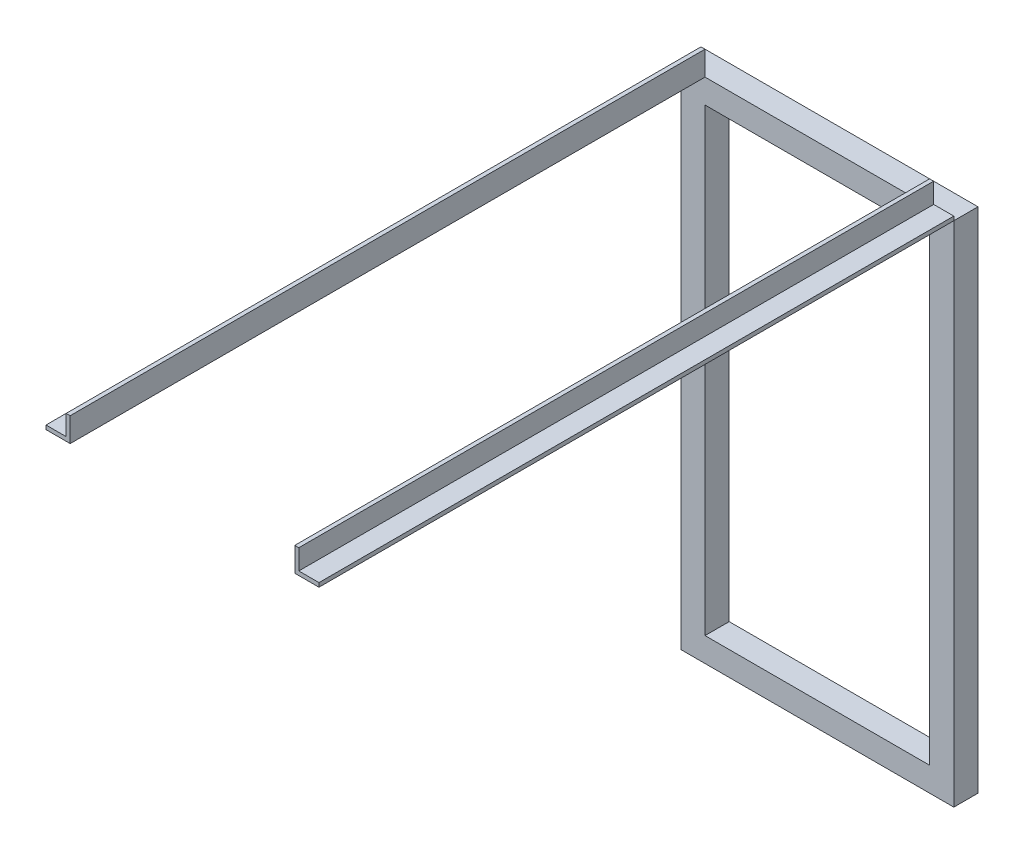
ISO-10303-21;
HEADER;
FILE_DESCRIPTION(('STEP AP214'),'2;1');
FILE_NAME('part.step','',(''),(''),'','','');
FILE_SCHEMA(('AUTOMOTIVE_DESIGN { 1 0 10303 214 1 1 1 1 }'));
ENDSEC;
DATA;
#1=APPLICATION_CONTEXT('core data for automotive mechanical design processes');
#2=APPLICATION_PROTOCOL_DEFINITION('international standard','automotive_design',2000,#1);
#3=PRODUCT_CONTEXT('',#1,'mechanical');
#4=PRODUCT('Part','Part','',(#3));
#5=PRODUCT_RELATED_PRODUCT_CATEGORY('part','',(#4));
#6=PRODUCT_DEFINITION_FORMATION('','',#4);
#7=PRODUCT_DEFINITION_CONTEXT('part definition',#1,'design');
#8=PRODUCT_DEFINITION('design','',#6,#7);
#9=PRODUCT_DEFINITION_SHAPE('','',#8);
#10=(LENGTH_UNIT() NAMED_UNIT(*) SI_UNIT(.MILLI.,.METRE.));
#11=(NAMED_UNIT(*) PLANE_ANGLE_UNIT() SI_UNIT($,.RADIAN.));
#12=(NAMED_UNIT(*) SI_UNIT($,.STERADIAN.) SOLID_ANGLE_UNIT());
#13=UNCERTAINTY_MEASURE_WITH_UNIT(LENGTH_MEASURE(1.E-05),#10,'distance_accuracy_value','');
#14=(GEOMETRIC_REPRESENTATION_CONTEXT(3) GLOBAL_UNCERTAINTY_ASSIGNED_CONTEXT((#13)) GLOBAL_UNIT_ASSIGNED_CONTEXT((#10,
#11,#12)) REPRESENTATION_CONTEXT('',''));
#15=CARTESIAN_POINT('',(0.,0.,0.));
#16=DIRECTION('',(0.,0.,1.));
#17=DIRECTION('',(1.,0.,0.));
#18=AXIS2_PLACEMENT_3D('',#15,#16,#17);
#19=CARTESIAN_POINT('',(430.,806.35,1038.1));
#20=DIRECTION('',(-1.,0.,0.));
#21=DIRECTION('',(0.,0.,1.));
#22=AXIS2_PLACEMENT_3D('',#19,#20,#21);
#23=PLANE('',#22);
#24=DIRECTION('',(0.,1.,0.));
#25=VECTOR('',#24,1.);
#26=CARTESIAN_POINT('',(430.,806.35,38.1));
#27=LINE('',#26,#25);
#28=CARTESIAN_POINT('',(430.,800.,38.1));
#29=VERTEX_POINT('',#28);
#30=CARTESIAN_POINT('',(430.,806.35,38.1));
#31=VERTEX_POINT('',#30);
#32=EDGE_CURVE('E128',#29,#31,#27,.T.);
#33=ORIENTED_EDGE('',*,*,#32,.T.);
#34=DIRECTION('',(0.,0.,-1.));
#35=VECTOR('',#34,1.);
#36=CARTESIAN_POINT('',(430.,806.35,1038.1));
#37=LINE('',#36,#35);
#38=CARTESIAN_POINT('',(430.,806.35,1038.1));
#39=VERTEX_POINT('',#38);
#40=EDGE_CURVE('E12',#39,#31,#37,.T.);
#41=ORIENTED_EDGE('',*,*,#40,.F.);
#42=DIRECTION('',(0.,1.,0.));
#43=VECTOR('',#42,1.);
#44=CARTESIAN_POINT('',(430.,806.35,1038.1));
#45=LINE('',#44,#43);
#46=CARTESIAN_POINT('',(430.,800.,1038.1));
#47=VERTEX_POINT('',#46);
#48=EDGE_CURVE('E138',#47,#39,#45,.T.);
#49=ORIENTED_EDGE('',*,*,#48,.F.);
#50=DIRECTION('',(0.,0.,-1.));
#51=VECTOR('',#50,1.);
#52=CARTESIAN_POINT('',(430.,800.,1038.1));
#53=LINE('',#52,#51);
#54=EDGE_CURVE('E124',#47,#29,#53,.T.);
#55=ORIENTED_EDGE('',*,*,#54,.T.);
#56=EDGE_LOOP('',(#33,#41,#49,#55));
#57=FACE_BOUND('',#56,.T.);
#58=ADVANCED_FACE('F44',(#57),#23,.F.);
#59=CARTESIAN_POINT('',(430.,806.35,1038.1));
#60=DIRECTION('',(0.,-1.,0.));
#61=DIRECTION('',(0.,0.,-1.));
#62=AXIS2_PLACEMENT_3D('',#59,#60,#61);
#63=PLANE('',#62);
#64=DIRECTION('',(-1.,0.,0.));
#65=VECTOR('',#64,1.);
#66=CARTESIAN_POINT('',(430.,806.35,38.1));
#67=LINE('',#66,#65);
#68=CARTESIAN_POINT('',(398.25,806.35,38.1));
#69=VERTEX_POINT('',#68);
#70=EDGE_CURVE('E131',#31,#69,#67,.T.);
#71=ORIENTED_EDGE('',*,*,#70,.T.);
#72=DIRECTION('',(0.,0.,-1.));
#73=VECTOR('',#72,1.);
#74=CARTESIAN_POINT('',(398.25,806.35,1038.1));
#75=LINE('',#74,#73);
#76=CARTESIAN_POINT('',(398.25,806.35,1038.1));
#77=VERTEX_POINT('',#76);
#78=EDGE_CURVE('E52',#77,#69,#75,.T.);
#79=ORIENTED_EDGE('',*,*,#78,.F.);
#80=DIRECTION('',(-1.,0.,0.));
#81=VECTOR('',#80,1.);
#82=CARTESIAN_POINT('',(430.,806.35,1038.1));
#83=LINE('',#82,#81);
#84=EDGE_CURVE('E97',#39,#77,#83,.T.);
#85=ORIENTED_EDGE('',*,*,#84,.F.);
#86=ORIENTED_EDGE('',*,*,#40,.T.);
#87=EDGE_LOOP('',(#71,#79,#85,#86));
#88=FACE_BOUND('',#87,.T.);
#89=ADVANCED_FACE('F162',(#88),#63,.F.);
#90=CARTESIAN_POINT('',(398.25,806.35,1038.1));
#91=DIRECTION('',(-1.,0.,0.));
#92=DIRECTION('',(0.,0.,1.));
#93=AXIS2_PLACEMENT_3D('',#90,#91,#92);
#94=PLANE('',#93);
#95=DIRECTION('',(0.,1.,0.));
#96=VECTOR('',#95,1.);
#97=CARTESIAN_POINT('',(398.25,806.35,38.1));
#98=LINE('',#97,#96);
#99=CARTESIAN_POINT('',(398.25,838.1,38.1));
#100=VERTEX_POINT('',#99);
#101=EDGE_CURVE('E133',#69,#100,#98,.T.);
#102=ORIENTED_EDGE('',*,*,#101,.T.);
#103=DIRECTION('',(0.,0.,-1.));
#104=VECTOR('',#103,1.);
#105=CARTESIAN_POINT('',(398.25,838.1,1038.1));
#106=LINE('',#105,#104);
#107=CARTESIAN_POINT('',(398.25,838.1,1038.1));
#108=VERTEX_POINT('',#107);
#109=EDGE_CURVE('E119',#108,#100,#106,.T.);
#110=ORIENTED_EDGE('',*,*,#109,.F.);
#111=DIRECTION('',(0.,1.,0.));
#112=VECTOR('',#111,1.);
#113=CARTESIAN_POINT('',(398.25,806.35,1038.1));
#114=LINE('',#113,#112);
#115=EDGE_CURVE('E110',#77,#108,#114,.T.);
#116=ORIENTED_EDGE('',*,*,#115,.F.);
#117=ORIENTED_EDGE('',*,*,#78,.T.);
#118=EDGE_LOOP('',(#102,#110,#116,#117));
#119=FACE_BOUND('',#118,.T.);
#120=ADVANCED_FACE('F144',(#119),#94,.F.);
#121=CARTESIAN_POINT('',(398.25,838.1,1038.1));
#122=DIRECTION('',(0.,-1.,0.));
#123=DIRECTION('',(0.,0.,-1.));
#124=AXIS2_PLACEMENT_3D('',#121,#122,#123);
#125=PLANE('',#124);
#126=DIRECTION('',(-1.,0.,0.));
#127=VECTOR('',#126,1.);
#128=CARTESIAN_POINT('',(398.25,838.1,38.1));
#129=LINE('',#128,#127);
#130=CARTESIAN_POINT('',(391.9,838.1,38.1));
#131=VERTEX_POINT('',#130);
#132=EDGE_CURVE('E118',#100,#131,#129,.T.);
#133=ORIENTED_EDGE('',*,*,#132,.T.);
#134=DIRECTION('',(0.,0.,-1.));
#135=VECTOR('',#134,1.);
#136=CARTESIAN_POINT('',(391.9,838.1,1038.1));
#137=LINE('',#136,#135);
#138=CARTESIAN_POINT('',(391.9,838.1,1038.1));
#139=VERTEX_POINT('',#138);
#140=EDGE_CURVE('E115',#139,#131,#137,.T.);
#141=ORIENTED_EDGE('',*,*,#140,.F.);
#142=DIRECTION('',(-1.,0.,0.));
#143=VECTOR('',#142,1.);
#144=CARTESIAN_POINT('',(398.25,838.1,1038.1));
#145=LINE('',#144,#143);
#146=EDGE_CURVE('E104',#108,#139,#145,.T.);
#147=ORIENTED_EDGE('',*,*,#146,.F.);
#148=ORIENTED_EDGE('',*,*,#109,.T.);
#149=EDGE_LOOP('',(#133,#141,#147,#148));
#150=FACE_BOUND('',#149,.T.);
#151=ADVANCED_FACE('F116',(#150),#125,.F.);
#152=CARTESIAN_POINT('',(391.9,800.,1038.1));
#153=DIRECTION('',(1.,0.,0.));
#154=DIRECTION('',(0.,0.,-1.));
#155=AXIS2_PLACEMENT_3D('',#152,#153,#154);
#156=PLANE('',#155);
#157=DIRECTION('',(0.,-1.,0.));
#158=VECTOR('',#157,1.);
#159=CARTESIAN_POINT('',(391.9,800.,38.1));
#160=LINE('',#159,#158);
#161=CARTESIAN_POINT('',(391.9,800.,38.1));
#162=VERTEX_POINT('',#161);
#163=EDGE_CURVE('E83',#131,#162,#160,.T.);
#164=ORIENTED_EDGE('',*,*,#163,.T.);
#165=DIRECTION('',(0.,0.,-1.));
#166=VECTOR('',#165,1.);
#167=CARTESIAN_POINT('',(391.9,800.,1038.1));
#168=LINE('',#167,#166);
#169=CARTESIAN_POINT('',(391.9,800.,1038.1));
#170=VERTEX_POINT('',#169);
#171=EDGE_CURVE('E120',#170,#162,#168,.T.);
#172=ORIENTED_EDGE('',*,*,#171,.F.);
#173=DIRECTION('',(0.,-1.,0.));
#174=VECTOR('',#173,1.);
#175=CARTESIAN_POINT('',(391.9,800.,1038.1));
#176=LINE('',#175,#174);
#177=EDGE_CURVE('E108',#139,#170,#176,.T.);
#178=ORIENTED_EDGE('',*,*,#177,.F.);
#179=ORIENTED_EDGE('',*,*,#140,.T.);
#180=EDGE_LOOP('',(#164,#172,#178,#179));
#181=FACE_BOUND('',#180,.T.);
#182=ADVANCED_FACE('F122',(#181),#156,.F.);
#183=CARTESIAN_POINT('',(430.,800.,1038.1));
#184=DIRECTION('',(0.,1.,0.));
#185=DIRECTION('',(0.,0.,1.));
#186=AXIS2_PLACEMENT_3D('',#183,#184,#185);
#187=PLANE('',#186);
#188=DIRECTION('',(1.,0.,0.));
#189=VECTOR('',#188,1.);
#190=CARTESIAN_POINT('',(430.,800.,38.1));
#191=LINE('',#190,#189);
#192=EDGE_CURVE('E89',#162,#29,#191,.T.);
#193=ORIENTED_EDGE('',*,*,#192,.T.);
#194=ORIENTED_EDGE('',*,*,#54,.F.);
#195=DIRECTION('',(1.,0.,0.));
#196=VECTOR('',#195,1.);
#197=CARTESIAN_POINT('',(430.,800.,1038.1));
#198=LINE('',#197,#196);
#199=EDGE_CURVE('E60',#170,#47,#198,.T.);
#200=ORIENTED_EDGE('',*,*,#199,.F.);
#201=ORIENTED_EDGE('',*,*,#171,.T.);
#202=EDGE_LOOP('',(#193,#194,#200,#201));
#203=FACE_BOUND('',#202,.T.);
#204=ADVANCED_FACE('F151',(#203),#187,.F.);
#205=CARTESIAN_POINT('',(0.,0.,1038.1));
#206=DIRECTION('',(0.,0.,-1.));
#207=DIRECTION('',(-1.,0.,0.));
#208=AXIS2_PLACEMENT_3D('',#205,#206,#207);
#209=PLANE('',#208);
#210=ORIENTED_EDGE('',*,*,#48,.T.);
#211=ORIENTED_EDGE('',*,*,#84,.T.);
#212=ORIENTED_EDGE('',*,*,#115,.T.);
#213=ORIENTED_EDGE('',*,*,#146,.T.);
#214=ORIENTED_EDGE('',*,*,#177,.T.);
#215=ORIENTED_EDGE('',*,*,#199,.T.);
#216=EDGE_LOOP('',(#210,#211,#212,#213,#214,#215));
#217=FACE_BOUND('',#216,.T.);
#218=ADVANCED_FACE('F106',(#217),#209,.F.);
#219=CARTESIAN_POINT('',(0.,0.,38.1));
#220=DIRECTION('',(0.,0.,-1.));
#221=DIRECTION('',(-1.,0.,0.));
#222=AXIS2_PLACEMENT_3D('',#219,#220,#221);
#223=PLANE('',#222);
#224=ORIENTED_EDGE('',*,*,#32,.F.);
#225=ORIENTED_EDGE('',*,*,#192,.F.);
#226=ORIENTED_EDGE('',*,*,#163,.F.);
#227=ORIENTED_EDGE('',*,*,#132,.F.);
#228=ORIENTED_EDGE('',*,*,#101,.F.);
#229=ORIENTED_EDGE('',*,*,#70,.F.);
#230=EDGE_LOOP('',(#224,#225,#226,#227,#228,#229));
#231=FACE_BOUND('',#230,.T.);
#232=ADVANCED_FACE('F147',(#231),#223,.T.);
#233=CLOSED_SHELL('',(#58,#89,#120,#151,#182,#204,#218,#232));
#234=MANIFOLD_SOLID_BREP('B2',#233);
#235=CARTESIAN_POINT('',(0.,806.35,1038.1));
#236=DIRECTION('',(1.,0.,0.));
#237=DIRECTION('',(0.,0.,-1.));
#238=AXIS2_PLACEMENT_3D('',#235,#236,#237);
#239=PLANE('',#238);
#240=DIRECTION('',(0.,-1.,0.));
#241=VECTOR('',#240,1.);
#242=CARTESIAN_POINT('',(0.,806.35,38.1));
#243=LINE('',#242,#241);
#244=CARTESIAN_POINT('',(0.,806.35,38.1));
#245=VERTEX_POINT('',#244);
#246=CARTESIAN_POINT('',(0.,800.,38.1));
#247=VERTEX_POINT('',#246);
#248=EDGE_CURVE('E313',#245,#247,#243,.T.);
#249=ORIENTED_EDGE('',*,*,#248,.T.);
#250=DIRECTION('',(0.,0.,-1.));
#251=VECTOR('',#250,1.);
#252=CARTESIAN_POINT('',(0.,800.,1038.1));
#253=LINE('',#252,#251);
#254=CARTESIAN_POINT('',(0.,800.,1038.1));
#255=VERTEX_POINT('',#254);
#256=EDGE_CURVE('E42',#255,#247,#253,.T.);
#257=ORIENTED_EDGE('',*,*,#256,.F.);
#258=DIRECTION('',(0.,-1.,0.));
#259=VECTOR('',#258,1.);
#260=CARTESIAN_POINT('',(0.,806.35,1038.1));
#261=LINE('',#260,#259);
#262=CARTESIAN_POINT('',(0.,806.35,1038.1));
#263=VERTEX_POINT('',#262);
#264=EDGE_CURVE('E323',#263,#255,#261,.T.);
#265=ORIENTED_EDGE('',*,*,#264,.F.);
#266=DIRECTION('',(0.,0.,-1.));
#267=VECTOR('',#266,1.);
#268=CARTESIAN_POINT('',(0.,806.35,1038.1));
#269=LINE('',#268,#267);
#270=EDGE_CURVE('E309',#263,#245,#269,.T.);
#271=ORIENTED_EDGE('',*,*,#270,.T.);
#272=EDGE_LOOP('',(#249,#257,#265,#271));
#273=FACE_BOUND('',#272,.T.);
#274=ADVANCED_FACE('F229',(#273),#239,.F.);
#275=CARTESIAN_POINT('',(0.,800.,1038.1));
#276=DIRECTION('',(0.,1.,0.));
#277=DIRECTION('',(0.,0.,1.));
#278=AXIS2_PLACEMENT_3D('',#275,#276,#277);
#279=PLANE('',#278);
#280=DIRECTION('',(1.,0.,0.));
#281=VECTOR('',#280,1.);
#282=CARTESIAN_POINT('',(0.,800.,38.1));
#283=LINE('',#282,#281);
#284=CARTESIAN_POINT('',(38.1,800.,38.1));
#285=VERTEX_POINT('',#284);
#286=EDGE_CURVE('E316',#247,#285,#283,.T.);
#287=ORIENTED_EDGE('',*,*,#286,.T.);
#288=DIRECTION('',(0.,0.,-1.));
#289=VECTOR('',#288,1.);
#290=CARTESIAN_POINT('',(38.1,800.,1038.1));
#291=LINE('',#290,#289);
#292=CARTESIAN_POINT('',(38.1,800.,1038.1));
#293=VERTEX_POINT('',#292);
#294=EDGE_CURVE('E237',#293,#285,#291,.T.);
#295=ORIENTED_EDGE('',*,*,#294,.F.);
#296=DIRECTION('',(1.,0.,0.));
#297=VECTOR('',#296,1.);
#298=CARTESIAN_POINT('',(0.,800.,1038.1));
#299=LINE('',#298,#297);
#300=EDGE_CURVE('E282',#255,#293,#299,.T.);
#301=ORIENTED_EDGE('',*,*,#300,.F.);
#302=ORIENTED_EDGE('',*,*,#256,.T.);
#303=EDGE_LOOP('',(#287,#295,#301,#302));
#304=FACE_BOUND('',#303,.T.);
#305=ADVANCED_FACE('F347',(#304),#279,.F.);
#306=CARTESIAN_POINT('',(38.1,800.,1038.1));
#307=DIRECTION('',(-1.,0.,0.));
#308=DIRECTION('',(0.,0.,1.));
#309=AXIS2_PLACEMENT_3D('',#306,#307,#308);
#310=PLANE('',#309);
#311=DIRECTION('',(0.,1.,0.));
#312=VECTOR('',#311,1.);
#313=CARTESIAN_POINT('',(38.1,800.,38.1));
#314=LINE('',#313,#312);
#315=CARTESIAN_POINT('',(38.1,838.1,38.1));
#316=VERTEX_POINT('',#315);
#317=EDGE_CURVE('E318',#285,#316,#314,.T.);
#318=ORIENTED_EDGE('',*,*,#317,.T.);
#319=DIRECTION('',(0.,0.,-1.));
#320=VECTOR('',#319,1.);
#321=CARTESIAN_POINT('',(38.1,838.1,1038.1));
#322=LINE('',#321,#320);
#323=CARTESIAN_POINT('',(38.1,838.1,1038.1));
#324=VERTEX_POINT('',#323);
#325=EDGE_CURVE('E304',#324,#316,#322,.T.);
#326=ORIENTED_EDGE('',*,*,#325,.F.);
#327=DIRECTION('',(0.,1.,0.));
#328=VECTOR('',#327,1.);
#329=CARTESIAN_POINT('',(38.1,800.,1038.1));
#330=LINE('',#329,#328);
#331=EDGE_CURVE('E295',#293,#324,#330,.T.);
#332=ORIENTED_EDGE('',*,*,#331,.F.);
#333=ORIENTED_EDGE('',*,*,#294,.T.);
#334=EDGE_LOOP('',(#318,#326,#332,#333));
#335=FACE_BOUND('',#334,.T.);
#336=ADVANCED_FACE('F329',(#335),#310,.F.);
#337=CARTESIAN_POINT('',(31.75,838.1,1038.1));
#338=DIRECTION('',(0.,-1.,0.));
#339=DIRECTION('',(0.,0.,-1.));
#340=AXIS2_PLACEMENT_3D('',#337,#338,#339);
#341=PLANE('',#340);
#342=DIRECTION('',(-1.,0.,0.));
#343=VECTOR('',#342,1.);
#344=CARTESIAN_POINT('',(31.75,838.1,38.1));
#345=LINE('',#344,#343);
#346=CARTESIAN_POINT('',(31.75,838.1,38.1));
#347=VERTEX_POINT('',#346);
#348=EDGE_CURVE('E303',#316,#347,#345,.T.);
#349=ORIENTED_EDGE('',*,*,#348,.T.);
#350=DIRECTION('',(0.,0.,-1.));
#351=VECTOR('',#350,1.);
#352=CARTESIAN_POINT('',(31.75,838.1,1038.1));
#353=LINE('',#352,#351);
#354=CARTESIAN_POINT('',(31.75,838.1,1038.1));
#355=VERTEX_POINT('',#354);
#356=EDGE_CURVE('E300',#355,#347,#353,.T.);
#357=ORIENTED_EDGE('',*,*,#356,.F.);
#358=DIRECTION('',(-1.,0.,0.));
#359=VECTOR('',#358,1.);
#360=CARTESIAN_POINT('',(31.75,838.1,1038.1));
#361=LINE('',#360,#359);
#362=EDGE_CURVE('E289',#324,#355,#361,.T.);
#363=ORIENTED_EDGE('',*,*,#362,.F.);
#364=ORIENTED_EDGE('',*,*,#325,.T.);
#365=EDGE_LOOP('',(#349,#357,#363,#364));
#366=FACE_BOUND('',#365,.T.);
#367=ADVANCED_FACE('F301',(#366),#341,.F.);
#368=CARTESIAN_POINT('',(31.75,806.35,1038.1));
#369=DIRECTION('',(1.,0.,0.));
#370=DIRECTION('',(0.,0.,-1.));
#371=AXIS2_PLACEMENT_3D('',#368,#369,#370);
#372=PLANE('',#371);
#373=DIRECTION('',(0.,-1.,0.));
#374=VECTOR('',#373,1.);
#375=CARTESIAN_POINT('',(31.75,806.35,38.1));
#376=LINE('',#375,#374);
#377=CARTESIAN_POINT('',(31.75,806.35,38.1));
#378=VERTEX_POINT('',#377);
#379=EDGE_CURVE('E268',#347,#378,#376,.T.);
#380=ORIENTED_EDGE('',*,*,#379,.T.);
#381=DIRECTION('',(0.,0.,-1.));
#382=VECTOR('',#381,1.);
#383=CARTESIAN_POINT('',(31.75,806.35,1038.1));
#384=LINE('',#383,#382);
#385=CARTESIAN_POINT('',(31.75,806.35,1038.1));
#386=VERTEX_POINT('',#385);
#387=EDGE_CURVE('E305',#386,#378,#384,.T.);
#388=ORIENTED_EDGE('',*,*,#387,.F.);
#389=DIRECTION('',(0.,-1.,0.));
#390=VECTOR('',#389,1.);
#391=CARTESIAN_POINT('',(31.75,806.35,1038.1));
#392=LINE('',#391,#390);
#393=EDGE_CURVE('E293',#355,#386,#392,.T.);
#394=ORIENTED_EDGE('',*,*,#393,.F.);
#395=ORIENTED_EDGE('',*,*,#356,.T.);
#396=EDGE_LOOP('',(#380,#388,#394,#395));
#397=FACE_BOUND('',#396,.T.);
#398=ADVANCED_FACE('F307',(#397),#372,.F.);
#399=CARTESIAN_POINT('',(0.,806.35,1038.1));
#400=DIRECTION('',(0.,-1.,0.));
#401=DIRECTION('',(0.,0.,-1.));
#402=AXIS2_PLACEMENT_3D('',#399,#400,#401);
#403=PLANE('',#402);
#404=DIRECTION('',(-1.,0.,0.));
#405=VECTOR('',#404,1.);
#406=CARTESIAN_POINT('',(0.,806.35,38.1));
#407=LINE('',#406,#405);
#408=EDGE_CURVE('E274',#378,#245,#407,.T.);
#409=ORIENTED_EDGE('',*,*,#408,.T.);
#410=ORIENTED_EDGE('',*,*,#270,.F.);
#411=DIRECTION('',(-1.,0.,0.));
#412=VECTOR('',#411,1.);
#413=CARTESIAN_POINT('',(0.,806.35,1038.1));
#414=LINE('',#413,#412);
#415=EDGE_CURVE('E245',#386,#263,#414,.T.);
#416=ORIENTED_EDGE('',*,*,#415,.F.);
#417=ORIENTED_EDGE('',*,*,#387,.T.);
#418=EDGE_LOOP('',(#409,#410,#416,#417));
#419=FACE_BOUND('',#418,.T.);
#420=ADVANCED_FACE('F336',(#419),#403,.F.);
#421=CARTESIAN_POINT('',(0.,0.,1038.1));
#422=DIRECTION('',(0.,0.,1.));
#423=DIRECTION('',(1.,0.,0.));
#424=AXIS2_PLACEMENT_3D('',#421,#422,#423);
#425=PLANE('',#424);
#426=ORIENTED_EDGE('',*,*,#264,.T.);
#427=ORIENTED_EDGE('',*,*,#300,.T.);
#428=ORIENTED_EDGE('',*,*,#331,.T.);
#429=ORIENTED_EDGE('',*,*,#362,.T.);
#430=ORIENTED_EDGE('',*,*,#393,.T.);
#431=ORIENTED_EDGE('',*,*,#415,.T.);
#432=EDGE_LOOP('',(#426,#427,#428,#429,#430,#431));
#433=FACE_BOUND('',#432,.T.);
#434=ADVANCED_FACE('F291',(#433),#425,.T.);
#435=CARTESIAN_POINT('',(0.,0.,38.1));
#436=DIRECTION('',(0.,0.,1.));
#437=DIRECTION('',(1.,0.,0.));
#438=AXIS2_PLACEMENT_3D('',#435,#436,#437);
#439=PLANE('',#438);
#440=ORIENTED_EDGE('',*,*,#248,.F.);
#441=ORIENTED_EDGE('',*,*,#408,.F.);
#442=ORIENTED_EDGE('',*,*,#379,.F.);
#443=ORIENTED_EDGE('',*,*,#348,.F.);
#444=ORIENTED_EDGE('',*,*,#317,.F.);
#445=ORIENTED_EDGE('',*,*,#286,.F.);
#446=EDGE_LOOP('',(#440,#441,#442,#443,#444,#445));
#447=FACE_BOUND('',#446,.T.);
#448=ADVANCED_FACE('F332',(#447),#439,.F.);
#449=CLOSED_SHELL('',(#274,#305,#336,#367,#398,#420,#434,#448));
#450=MANIFOLD_SOLID_BREP('B6',#449);
#451=CARTESIAN_POINT('',(0.,0.,38.1));
#452=DIRECTION('',(0.,0.,-1.));
#453=DIRECTION('',(-1.,0.,0.));
#454=AXIS2_PLACEMENT_3D('',#451,#452,#453);
#455=PLANE('',#454);
#456=DIRECTION('',(1.,0.,0.));
#457=VECTOR('',#456,1.);
#458=CARTESIAN_POINT('',(430.,0.,38.1));
#459=LINE('',#458,#457);
#460=CARTESIAN_POINT('',(0.,0.,38.1));
#461=VERTEX_POINT('',#460);
#462=CARTESIAN_POINT('',(430.,0.,38.1));
#463=VERTEX_POINT('',#462);
#464=EDGE_CURVE('E506',#461,#463,#459,.T.);
#465=ORIENTED_EDGE('',*,*,#464,.T.);
#466=DIRECTION('',(0.,1.,0.));
#467=VECTOR('',#466,1.);
#468=CARTESIAN_POINT('',(430.,800.,38.1));
#469=LINE('',#468,#467);
#470=CARTESIAN_POINT('',(430.,800.,38.1));
#471=VERTEX_POINT('',#470);
#472=EDGE_CURVE('E509',#463,#471,#469,.T.);
#473=ORIENTED_EDGE('',*,*,#472,.T.);
#474=DIRECTION('',(-1.,0.,0.));
#475=VECTOR('',#474,1.);
#476=CARTESIAN_POINT('',(0.,800.,38.1));
#477=LINE('',#476,#475);
#478=CARTESIAN_POINT('',(0.,800.,38.1));
#479=VERTEX_POINT('',#478);
#480=EDGE_CURVE('E512',#471,#479,#477,.T.);
#481=ORIENTED_EDGE('',*,*,#480,.T.);
#482=DIRECTION('',(0.,-1.,0.));
#483=VECTOR('',#482,1.);
#484=CARTESIAN_POINT('',(0.,0.,38.1));
#485=LINE('',#484,#483);
#486=EDGE_CURVE('E514',#479,#461,#485,.T.);
#487=ORIENTED_EDGE('',*,*,#486,.T.);
#488=EDGE_LOOP('',(#465,#473,#481,#487));
#489=FACE_BOUND('',#488,.T.);
#490=DIRECTION('',(0.,-1.,0.));
#491=VECTOR('',#490,1.);
#492=CARTESIAN_POINT('',(38.1,38.1,38.1));
#493=LINE('',#492,#491);
#494=CARTESIAN_POINT('',(38.1,761.9,38.1));
#495=VERTEX_POINT('',#494);
#496=CARTESIAN_POINT('',(38.1,38.1,38.1));
#497=VERTEX_POINT('',#496);
#498=EDGE_CURVE('E470',#495,#497,#493,.T.);
#499=ORIENTED_EDGE('',*,*,#498,.F.);
#500=DIRECTION('',(-1.,0.,0.));
#501=VECTOR('',#500,1.);
#502=CARTESIAN_POINT('',(38.1,761.9,38.1));
#503=LINE('',#502,#501);
#504=CARTESIAN_POINT('',(391.9,761.9,38.1));
#505=VERTEX_POINT('',#504);
#506=EDGE_CURVE('E492',#505,#495,#503,.T.);
#507=ORIENTED_EDGE('',*,*,#506,.F.);
#508=DIRECTION('',(0.,1.,0.));
#509=VECTOR('',#508,1.);
#510=CARTESIAN_POINT('',(391.9,761.9,38.1));
#511=LINE('',#510,#509);
#512=CARTESIAN_POINT('',(391.9,38.1,38.1));
#513=VERTEX_POINT('',#512);
#514=EDGE_CURVE('E490',#513,#505,#511,.T.);
#515=ORIENTED_EDGE('',*,*,#514,.F.);
#516=DIRECTION('',(1.,0.,0.));
#517=VECTOR('',#516,1.);
#518=CARTESIAN_POINT('',(391.9,38.1,38.1));
#519=LINE('',#518,#517);
#520=EDGE_CURVE('E478',#497,#513,#519,.T.);
#521=ORIENTED_EDGE('',*,*,#520,.F.);
#522=EDGE_LOOP('',(#499,#507,#515,#521));
#523=FACE_BOUND('',#522,.T.);
#524=ADVANCED_FACE('F405',(#489,#523),#455,.F.);
#525=CARTESIAN_POINT('',(0.,0.,0.));
#526=DIRECTION('',(0.,0.,-1.));
#527=DIRECTION('',(-1.,0.,0.));
#528=AXIS2_PLACEMENT_3D('',#525,#526,#527);
#529=PLANE('',#528);
#530=DIRECTION('',(1.,0.,0.));
#531=VECTOR('',#530,1.);
#532=CARTESIAN_POINT('',(430.,0.,0.));
#533=LINE('',#532,#531);
#534=CARTESIAN_POINT('',(0.,0.,0.));
#535=VERTEX_POINT('',#534);
#536=CARTESIAN_POINT('',(430.,0.,0.));
#537=VERTEX_POINT('',#536);
#538=EDGE_CURVE('E486',#535,#537,#533,.T.);
#539=ORIENTED_EDGE('',*,*,#538,.F.);
#540=DIRECTION('',(0.,-1.,0.));
#541=VECTOR('',#540,1.);
#542=CARTESIAN_POINT('',(0.,0.,0.));
#543=LINE('',#542,#541);
#544=CARTESIAN_POINT('',(0.,800.,0.));
#545=VERTEX_POINT('',#544);
#546=EDGE_CURVE('E510',#545,#535,#543,.T.);
#547=ORIENTED_EDGE('',*,*,#546,.F.);
#548=DIRECTION('',(-1.,0.,0.));
#549=VECTOR('',#548,1.);
#550=CARTESIAN_POINT('',(0.,800.,0.));
#551=LINE('',#550,#549);
#552=CARTESIAN_POINT('',(430.,800.,0.));
#553=VERTEX_POINT('',#552);
#554=EDGE_CURVE('E521',#553,#545,#551,.T.);
#555=ORIENTED_EDGE('',*,*,#554,.F.);
#556=DIRECTION('',(0.,1.,0.));
#557=VECTOR('',#556,1.);
#558=CARTESIAN_POINT('',(430.,800.,0.));
#559=LINE('',#558,#557);
#560=EDGE_CURVE('E519',#537,#553,#559,.T.);
#561=ORIENTED_EDGE('',*,*,#560,.F.);
#562=EDGE_LOOP('',(#539,#547,#555,#561));
#563=FACE_BOUND('',#562,.T.);
#564=DIRECTION('',(-1.,0.,0.));
#565=VECTOR('',#564,1.);
#566=CARTESIAN_POINT('',(38.1,761.9,0.));
#567=LINE('',#566,#565);
#568=CARTESIAN_POINT('',(391.9,761.9,0.));
#569=VERTEX_POINT('',#568);
#570=CARTESIAN_POINT('',(38.1,761.9,0.));
#571=VERTEX_POINT('',#570);
#572=EDGE_CURVE('E479',#569,#571,#567,.T.);
#573=ORIENTED_EDGE('',*,*,#572,.T.);
#574=DIRECTION('',(0.,-1.,0.));
#575=VECTOR('',#574,1.);
#576=CARTESIAN_POINT('',(38.1,38.1,0.));
#577=LINE('',#576,#575);
#578=CARTESIAN_POINT('',(38.1,38.1,0.));
#579=VERTEX_POINT('',#578);
#580=EDGE_CURVE('E428',#571,#579,#577,.T.);
#581=ORIENTED_EDGE('',*,*,#580,.T.);
#582=DIRECTION('',(1.,0.,0.));
#583=VECTOR('',#582,1.);
#584=CARTESIAN_POINT('',(391.9,38.1,0.));
#585=LINE('',#584,#583);
#586=CARTESIAN_POINT('',(391.9,38.1,0.));
#587=VERTEX_POINT('',#586);
#588=EDGE_CURVE('E485',#579,#587,#585,.T.);
#589=ORIENTED_EDGE('',*,*,#588,.T.);
#590=DIRECTION('',(0.,1.,0.));
#591=VECTOR('',#590,1.);
#592=CARTESIAN_POINT('',(391.9,761.9,0.));
#593=LINE('',#592,#591);
#594=EDGE_CURVE('E498',#587,#569,#593,.T.);
#595=ORIENTED_EDGE('',*,*,#594,.T.);
#596=EDGE_LOOP('',(#573,#581,#589,#595));
#597=FACE_BOUND('',#596,.T.);
#598=ADVANCED_FACE('F539',(#563,#597),#529,.T.);
#599=CARTESIAN_POINT('',(430.,0.,38.1));
#600=DIRECTION('',(0.,1.,0.));
#601=DIRECTION('',(-1.,0.,0.));
#602=AXIS2_PLACEMENT_3D('',#599,#600,#601);
#603=PLANE('',#602);
#604=ORIENTED_EDGE('',*,*,#538,.T.);
#605=DIRECTION('',(0.,0.,-1.));
#606=VECTOR('',#605,1.);
#607=CARTESIAN_POINT('',(430.,0.,38.1));
#608=LINE('',#607,#606);
#609=EDGE_CURVE('E227',#463,#537,#608,.T.);
#610=ORIENTED_EDGE('',*,*,#609,.F.);
#611=ORIENTED_EDGE('',*,*,#464,.F.);
#612=DIRECTION('',(0.,0.,-1.));
#613=VECTOR('',#612,1.);
#614=CARTESIAN_POINT('',(0.,0.,38.1));
#615=LINE('',#614,#613);
#616=EDGE_CURVE('E516',#461,#535,#615,.T.);
#617=ORIENTED_EDGE('',*,*,#616,.T.);
#618=EDGE_LOOP('',(#604,#610,#611,#617));
#619=FACE_BOUND('',#618,.T.);
#620=ADVANCED_FACE('F407',(#619),#603,.F.);
#621=CARTESIAN_POINT('',(430.,800.,38.1));
#622=DIRECTION('',(-1.,0.,0.));
#623=DIRECTION('',(0.,-1.,0.));
#624=AXIS2_PLACEMENT_3D('',#621,#622,#623);
#625=PLANE('',#624);
#626=ORIENTED_EDGE('',*,*,#560,.T.);
#627=DIRECTION('',(0.,0.,-1.));
#628=VECTOR('',#627,1.);
#629=CARTESIAN_POINT('',(430.,800.,38.1));
#630=LINE('',#629,#628);
#631=EDGE_CURVE('E413',#471,#553,#630,.T.);
#632=ORIENTED_EDGE('',*,*,#631,.F.);
#633=ORIENTED_EDGE('',*,*,#472,.F.);
#634=ORIENTED_EDGE('',*,*,#609,.T.);
#635=EDGE_LOOP('',(#626,#632,#633,#634));
#636=FACE_BOUND('',#635,.T.);
#637=ADVANCED_FACE('F549',(#636),#625,.F.);
#638=CARTESIAN_POINT('',(0.,800.,38.1));
#639=DIRECTION('',(0.,-1.,0.));
#640=DIRECTION('',(0.,0.,-1.));
#641=AXIS2_PLACEMENT_3D('',#638,#639,#640);
#642=PLANE('',#641);
#643=ORIENTED_EDGE('',*,*,#554,.T.);
#644=DIRECTION('',(0.,0.,-1.));
#645=VECTOR('',#644,1.);
#646=CARTESIAN_POINT('',(0.,800.,38.1));
#647=LINE('',#646,#645);
#648=EDGE_CURVE('E526',#479,#545,#647,.T.);
#649=ORIENTED_EDGE('',*,*,#648,.F.);
#650=ORIENTED_EDGE('',*,*,#480,.F.);
#651=ORIENTED_EDGE('',*,*,#631,.T.);
#652=EDGE_LOOP('',(#643,#649,#650,#651));
#653=FACE_BOUND('',#652,.T.);
#654=ADVANCED_FACE('F533',(#653),#642,.F.);
#655=CARTESIAN_POINT('',(0.,0.,38.1));
#656=DIRECTION('',(1.,0.,0.));
#657=DIRECTION('',(0.,0.,-1.));
#658=AXIS2_PLACEMENT_3D('',#655,#656,#657);
#659=PLANE('',#658);
#660=ORIENTED_EDGE('',*,*,#546,.T.);
#661=ORIENTED_EDGE('',*,*,#616,.F.);
#662=ORIENTED_EDGE('',*,*,#486,.F.);
#663=ORIENTED_EDGE('',*,*,#648,.T.);
#664=EDGE_LOOP('',(#660,#661,#662,#663));
#665=FACE_BOUND('',#664,.T.);
#666=ADVANCED_FACE('F543',(#665),#659,.F.);
#667=CARTESIAN_POINT('',(38.1,38.1,38.1));
#668=DIRECTION('',(1.,0.,0.));
#669=DIRECTION('',(0.,0.,-1.));
#670=AXIS2_PLACEMENT_3D('',#667,#668,#669);
#671=PLANE('',#670);
#672=ORIENTED_EDGE('',*,*,#580,.F.);
#673=DIRECTION('',(0.,0.,-1.));
#674=VECTOR('',#673,1.);
#675=CARTESIAN_POINT('',(38.1,761.9,38.1));
#676=LINE('',#675,#674);
#677=EDGE_CURVE('E474',#495,#571,#676,.T.);
#678=ORIENTED_EDGE('',*,*,#677,.F.);
#679=ORIENTED_EDGE('',*,*,#498,.T.);
#680=DIRECTION('',(0.,0.,-1.));
#681=VECTOR('',#680,1.);
#682=CARTESIAN_POINT('',(38.1,38.1,38.1));
#683=LINE('',#682,#681);
#684=EDGE_CURVE('E473',#497,#579,#683,.T.);
#685=ORIENTED_EDGE('',*,*,#684,.T.);
#686=EDGE_LOOP('',(#672,#678,#679,#685));
#687=FACE_BOUND('',#686,.T.);
#688=ADVANCED_FACE('F472',(#687),#671,.T.);
#689=CARTESIAN_POINT('',(391.9,38.1,38.1));
#690=DIRECTION('',(0.,1.,0.));
#691=DIRECTION('',(0.,0.,1.));
#692=AXIS2_PLACEMENT_3D('',#689,#690,#691);
#693=PLANE('',#692);
#694=ORIENTED_EDGE('',*,*,#588,.F.);
#695=ORIENTED_EDGE('',*,*,#684,.F.);
#696=ORIENTED_EDGE('',*,*,#520,.T.);
#697=DIRECTION('',(0.,0.,-1.));
#698=VECTOR('',#697,1.);
#699=CARTESIAN_POINT('',(391.9,38.1,38.1));
#700=LINE('',#699,#698);
#701=EDGE_CURVE('E487',#513,#587,#700,.T.);
#702=ORIENTED_EDGE('',*,*,#701,.T.);
#703=EDGE_LOOP('',(#694,#695,#696,#702));
#704=FACE_BOUND('',#703,.T.);
#705=ADVANCED_FACE('F482',(#704),#693,.T.);
#706=CARTESIAN_POINT('',(391.9,761.9,38.1));
#707=DIRECTION('',(-1.,0.,0.));
#708=DIRECTION('',(0.,-1.,0.));
#709=AXIS2_PLACEMENT_3D('',#706,#707,#708);
#710=PLANE('',#709);
#711=ORIENTED_EDGE('',*,*,#594,.F.);
#712=ORIENTED_EDGE('',*,*,#701,.F.);
#713=ORIENTED_EDGE('',*,*,#514,.T.);
#714=DIRECTION('',(0.,0.,-1.));
#715=VECTOR('',#714,1.);
#716=CARTESIAN_POINT('',(391.9,761.9,38.1));
#717=LINE('',#716,#715);
#718=EDGE_CURVE('E420',#505,#569,#717,.T.);
#719=ORIENTED_EDGE('',*,*,#718,.T.);
#720=EDGE_LOOP('',(#711,#712,#713,#719));
#721=FACE_BOUND('',#720,.T.);
#722=ADVANCED_FACE('F572',(#721),#710,.T.);
#723=CARTESIAN_POINT('',(38.1,761.9,38.1));
#724=DIRECTION('',(0.,-1.,0.));
#725=DIRECTION('',(0.,0.,-1.));
#726=AXIS2_PLACEMENT_3D('',#723,#724,#725);
#727=PLANE('',#726);
#728=ORIENTED_EDGE('',*,*,#572,.F.);
#729=ORIENTED_EDGE('',*,*,#718,.F.);
#730=ORIENTED_EDGE('',*,*,#506,.T.);
#731=ORIENTED_EDGE('',*,*,#677,.T.);
#732=EDGE_LOOP('',(#728,#729,#730,#731));
#733=FACE_BOUND('',#732,.T.);
#734=ADVANCED_FACE('F576',(#733),#727,.T.);
#735=CLOSED_SHELL('',(#524,#598,#620,#637,#654,#666,#688,#705,#722,#734));
#736=MANIFOLD_SOLID_BREP('B36',#735);
#737=ADVANCED_BREP_SHAPE_REPRESENTATION('',(#18,#234,#450,#736),#14);
#738=SHAPE_DEFINITION_REPRESENTATION(#9,#737);
ENDSEC;
END-ISO-10303-21;
